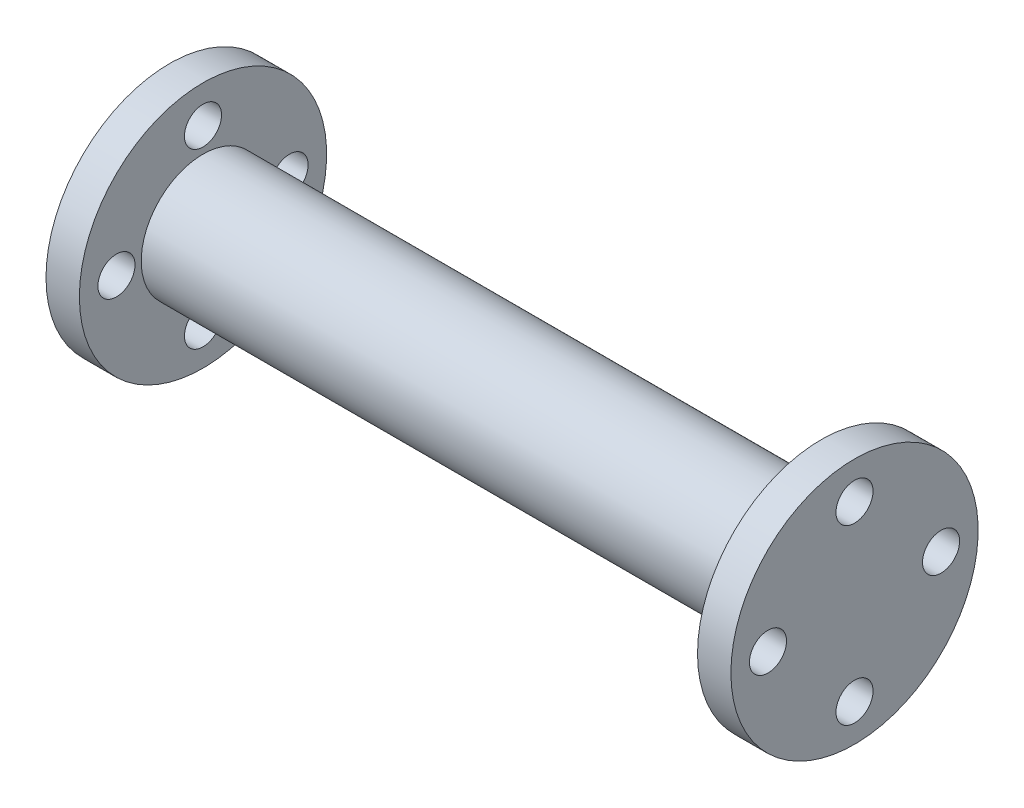
ISO-10303-21;
HEADER;
FILE_DESCRIPTION(('STEP AP214'),'2;1');
FILE_NAME('part.step','',(''),(''),'','','');
FILE_SCHEMA(('AUTOMOTIVE_DESIGN { 1 0 10303 214 1 1 1 1 }'));
ENDSEC;
DATA;
#1=APPLICATION_CONTEXT('core data for automotive mechanical design processes');
#2=APPLICATION_PROTOCOL_DEFINITION('international standard','automotive_design',2000,#1);
#3=PRODUCT_CONTEXT('',#1,'mechanical');
#4=PRODUCT('Part','Part','',(#3));
#5=PRODUCT_RELATED_PRODUCT_CATEGORY('part','',(#4));
#6=PRODUCT_DEFINITION_FORMATION('','',#4);
#7=PRODUCT_DEFINITION_CONTEXT('part definition',#1,'design');
#8=PRODUCT_DEFINITION('design','',#6,#7);
#9=PRODUCT_DEFINITION_SHAPE('','',#8);
#10=(LENGTH_UNIT() NAMED_UNIT(*) SI_UNIT(.MILLI.,.METRE.));
#11=(NAMED_UNIT(*) PLANE_ANGLE_UNIT() SI_UNIT($,.RADIAN.));
#12=(NAMED_UNIT(*) SI_UNIT($,.STERADIAN.) SOLID_ANGLE_UNIT());
#13=UNCERTAINTY_MEASURE_WITH_UNIT(LENGTH_MEASURE(1.E-05),#10,'distance_accuracy_value','');
#14=(GEOMETRIC_REPRESENTATION_CONTEXT(3) GLOBAL_UNCERTAINTY_ASSIGNED_CONTEXT((#13)) GLOBAL_UNIT_ASSIGNED_CONTEXT((#10,
#11,#12)) REPRESENTATION_CONTEXT('',''));
#15=CARTESIAN_POINT('',(0.,0.,0.));
#16=DIRECTION('',(0.,0.,1.));
#17=DIRECTION('',(1.,0.,0.));
#18=AXIS2_PLACEMENT_3D('',#15,#16,#17);
#19=CARTESIAN_POINT('',(2.7,0.,0.));
#20=DIRECTION('',(-1.,0.,0.));
#21=DIRECTION('',(0.,0.,1.));
#22=AXIS2_PLACEMENT_3D('',#19,#20,#21);
#23=CYLINDRICAL_SURFACE('',#22,10.);
#24=CARTESIAN_POINT('',(2.7,0.,0.));
#25=DIRECTION('',(1.,0.,0.));
#26=DIRECTION('',(0.,0.,-1.));
#27=AXIS2_PLACEMENT_3D('',#24,#25,#26);
#28=CIRCLE('',#27,10.);
#29=CARTESIAN_POINT('',(2.7,0.,10.));
#30=VERTEX_POINT('',#29);
#31=EDGE_CURVE('E39',#30,#30,#28,.T.);
#32=CARTESIAN_POINT('',(0.,0.,0.));
#33=DIRECTION('',(1.,0.,0.));
#34=DIRECTION('',(0.,0.,-1.));
#35=AXIS2_PLACEMENT_3D('',#32,#33,#34);
#36=CIRCLE('',#35,10.);
#37=CARTESIAN_POINT('',(0.,0.,10.));
#38=VERTEX_POINT('',#37);
#39=EDGE_CURVE('E44',#38,#38,#36,.T.);
#40=CARTESIAN_POINT('',(2.7,0.,10.));
#41=CARTESIAN_POINT('',(2.671875,0.,10.));
#42=CARTESIAN_POINT('',(2.64375,0.,10.));
#43=CARTESIAN_POINT('',(2.5875,0.,10.));
#44=CARTESIAN_POINT('',(2.559375,0.,10.));
#45=CARTESIAN_POINT('',(2.503125,0.,10.));
#46=CARTESIAN_POINT('',(2.475,0.,10.));
#47=CARTESIAN_POINT('',(2.41875,0.,10.));
#48=CARTESIAN_POINT('',(2.390625,0.,10.));
#49=CARTESIAN_POINT('',(2.334375,0.,10.));
#50=CARTESIAN_POINT('',(2.30625,0.,10.));
#51=CARTESIAN_POINT('',(2.25,0.,10.));
#52=CARTESIAN_POINT('',(2.221875,0.,10.));
#53=CARTESIAN_POINT('',(2.165625,0.,10.));
#54=CARTESIAN_POINT('',(2.1375,0.,10.));
#55=CARTESIAN_POINT('',(2.08125,0.,10.));
#56=CARTESIAN_POINT('',(2.053125,0.,10.));
#57=CARTESIAN_POINT('',(1.996875,0.,10.));
#58=CARTESIAN_POINT('',(1.96875,0.,10.));
#59=CARTESIAN_POINT('',(1.9125,0.,10.));
#60=CARTESIAN_POINT('',(1.884375,0.,10.));
#61=CARTESIAN_POINT('',(1.828125,0.,10.));
#62=CARTESIAN_POINT('',(1.8,0.,10.));
#63=CARTESIAN_POINT('',(1.74375,0.,10.));
#64=CARTESIAN_POINT('',(1.715625,0.,10.));
#65=CARTESIAN_POINT('',(1.659375,0.,10.));
#66=CARTESIAN_POINT('',(1.63125,0.,10.));
#67=CARTESIAN_POINT('',(1.575,0.,10.));
#68=CARTESIAN_POINT('',(1.546875,0.,10.));
#69=CARTESIAN_POINT('',(1.490625,0.,10.));
#70=CARTESIAN_POINT('',(1.4625,0.,10.));
#71=CARTESIAN_POINT('',(1.40625,0.,10.));
#72=CARTESIAN_POINT('',(1.378125,0.,10.));
#73=CARTESIAN_POINT('',(1.321875,0.,10.));
#74=CARTESIAN_POINT('',(1.29375,0.,10.));
#75=CARTESIAN_POINT('',(1.2375,0.,10.));
#76=CARTESIAN_POINT('',(1.209375,0.,10.));
#77=CARTESIAN_POINT('',(1.153125,0.,10.));
#78=CARTESIAN_POINT('',(1.125,0.,10.));
#79=CARTESIAN_POINT('',(1.06875,0.,10.));
#80=CARTESIAN_POINT('',(1.040625,0.,10.));
#81=CARTESIAN_POINT('',(0.984375,0.,10.));
#82=CARTESIAN_POINT('',(0.956249999999999,0.,10.));
#83=CARTESIAN_POINT('',(0.899999999999999,0.,10.));
#84=CARTESIAN_POINT('',(0.871875,0.,10.));
#85=CARTESIAN_POINT('',(0.815624999999999,0.,10.));
#86=CARTESIAN_POINT('',(0.787499999999999,0.,10.));
#87=CARTESIAN_POINT('',(0.73125,0.,10.));
#88=CARTESIAN_POINT('',(0.703125,0.,10.));
#89=CARTESIAN_POINT('',(0.646875,0.,10.));
#90=CARTESIAN_POINT('',(0.61875,0.,10.));
#91=CARTESIAN_POINT('',(0.5625,0.,10.));
#92=CARTESIAN_POINT('',(0.534375,0.,10.));
#93=CARTESIAN_POINT('',(0.478125,0.,10.));
#94=CARTESIAN_POINT('',(0.45,0.,10.));
#95=CARTESIAN_POINT('',(0.39375,0.,10.));
#96=CARTESIAN_POINT('',(0.365625,0.,10.));
#97=CARTESIAN_POINT('',(0.309375,0.,10.));
#98=CARTESIAN_POINT('',(0.28125,0.,10.));
#99=CARTESIAN_POINT('',(0.225,0.,10.));
#100=CARTESIAN_POINT('',(0.196875,0.,10.));
#101=CARTESIAN_POINT('',(0.140625,0.,10.));
#102=CARTESIAN_POINT('',(0.1125,0.,10.));
#103=CARTESIAN_POINT('',(0.0562499999999997,0.,10.));
#104=CARTESIAN_POINT('',(0.0281249999999996,0.,10.));
#105=CARTESIAN_POINT('',(0.,0.,10.));
#106=B_SPLINE_CURVE_WITH_KNOTS('',3,(#40,#41,#42,#43,#44,#45,#46,#47,#48,#49,#50,#51,#52,#53,
#54,#55,#56,#57,#58,#59,#60,#61,#62,#63,#64,#65,#66,#67,#68,#69,#70,#71,#72,#73,#74,#75,#76,#77,
#78,#79,#80,#81,#82,#83,#84,#85,#86,#87,#88,#89,#90,#91,#92,#93,#94,#95,#96,#97,#98,#99,#100,
#101,#102,#103,#104,#105),.UNSPECIFIED.,.F.,.F.,(4,2,2,2,2,2,2,2,2,2,2,2,2,2,2,2,2,2,2,2,2,2,2,
2,2,2,2,2,2,2,2,2,4),(0.,0.0843750000000003,0.16875,0.253125,0.3375,0.421875,0.50625,0.590625,
0.675,0.759375,0.84375,0.928125000000001,1.0125,1.096875,1.18125,1.265625,1.35,1.434375,1.51875,
1.603125,1.6875,1.771875,1.85625,1.940625,2.025,2.109375,2.19375,2.278125,2.3625,2.446875,
2.53125,2.615625,2.7),.UNSPECIFIED.);
#107=EDGE_CURVE('BSEAM32',#30,#38,#106,.T.);
#108=ORIENTED_EDGE('',*,*,#31,.F.);
#109=ORIENTED_EDGE('',*,*,#39,.T.);
#110=ORIENTED_EDGE('',*,*,#107,.T.);
#111=ORIENTED_EDGE('',*,*,#107,.F.);
#112=EDGE_LOOP('',(#108,#110,#109,#111));
#113=FACE_BOUND('',#112,.T.);
#114=ADVANCED_FACE('F32',(#113),#23,.T.);
#115=CARTESIAN_POINT('',(2.7,0.,0.));
#116=DIRECTION('',(1.,0.,0.));
#117=DIRECTION('',(0.,0.,-1.));
#118=AXIS2_PLACEMENT_3D('',#115,#116,#117);
#119=PLANE('',#118);
#120=CARTESIAN_POINT('',(2.7,7.,0.));
#121=DIRECTION('',(1.,0.,0.));
#122=DIRECTION('',(0.,0.,-1.));
#123=AXIS2_PLACEMENT_3D('',#120,#121,#122);
#124=CIRCLE('',#123,1.5);
#125=CARTESIAN_POINT('',(2.7,7.,-1.5));
#126=VERTEX_POINT('',#125);
#127=EDGE_CURVE('E83',#126,#126,#124,.T.);
#128=ORIENTED_EDGE('',*,*,#127,.F.);
#129=EDGE_LOOP('',(#128));
#130=FACE_BOUND('',#129,.T.);
#131=CARTESIAN_POINT('',(2.7,1.98094713253425E-13,-7.0000000000002));
#132=DIRECTION('',(1.,0.,0.));
#133=DIRECTION('',(0.,0.,-1.));
#134=AXIS2_PLACEMENT_3D('',#131,#132,#133);
#135=CIRCLE('',#134,1.50000000000015);
#136=CARTESIAN_POINT('',(2.7,1.98094713253425E-13,-8.50000000000035));
#137=VERTEX_POINT('',#136);
#138=EDGE_CURVE('E68',#137,#137,#135,.T.);
#139=ORIENTED_EDGE('',*,*,#138,.F.);
#140=EDGE_LOOP('',(#139));
#141=FACE_BOUND('',#140,.T.);
#142=CARTESIAN_POINT('',(2.7,-7.,-3.9618942650685E-13));
#143=DIRECTION('',(1.,0.,0.));
#144=DIRECTION('',(0.,0.,-1.));
#145=AXIS2_PLACEMENT_3D('',#142,#143,#144);
#146=CIRCLE('',#145,1.50000000000043);
#147=CARTESIAN_POINT('',(2.7,-7.,-1.50000000000082));
#148=VERTEX_POINT('',#147);
#149=EDGE_CURVE('E64',#148,#148,#146,.T.);
#150=ORIENTED_EDGE('',*,*,#149,.F.);
#151=EDGE_LOOP('',(#150));
#152=FACE_BOUND('',#151,.T.);
#153=CARTESIAN_POINT('',(2.7,-1.98951966012828E-13,6.9999999999998));
#154=DIRECTION('',(1.,0.,0.));
#155=DIRECTION('',(0.,0.,-1.));
#156=AXIS2_PLACEMENT_3D('',#153,#154,#155);
#157=CIRCLE('',#156,1.50000000000032);
#158=CARTESIAN_POINT('',(2.7,-1.98951966012828E-13,5.49999999999948));
#159=VERTEX_POINT('',#158);
#160=EDGE_CURVE('E60',#159,#159,#157,.T.);
#161=ORIENTED_EDGE('',*,*,#160,.F.);
#162=EDGE_LOOP('',(#161));
#163=FACE_BOUND('',#162,.T.);
#164=CARTESIAN_POINT('',(2.7,0.,0.));
#165=DIRECTION('',(1.,0.,0.));
#166=DIRECTION('',(0.,0.,-1.));
#167=AXIS2_PLACEMENT_3D('',#164,#165,#166);
#168=CIRCLE('',#167,5.);
#169=CARTESIAN_POINT('',(2.7,0.,-5.));
#170=VERTEX_POINT('',#169);
#171=EDGE_CURVE('E10',#170,#170,#168,.T.);
#172=ORIENTED_EDGE('',*,*,#171,.F.);
#173=EDGE_LOOP('',(#172));
#174=FACE_BOUND('',#173,.T.);
#175=ORIENTED_EDGE('',*,*,#31,.T.);
#176=EDGE_LOOP('',(#175));
#177=FACE_BOUND('',#176,.T.);
#178=ADVANCED_FACE('F113',(#130,#141,#152,#163,#174,#177),#119,.T.);
#179=CARTESIAN_POINT('',(0.,0.,0.));
#180=DIRECTION('',(1.,0.,0.));
#181=DIRECTION('',(0.,0.,-1.));
#182=AXIS2_PLACEMENT_3D('',#179,#180,#181);
#183=PLANE('',#182);
#184=CARTESIAN_POINT('',(0.,7.,0.));
#185=DIRECTION('',(1.,0.,0.));
#186=DIRECTION('',(0.,0.,-1.));
#187=AXIS2_PLACEMENT_3D('',#184,#185,#186);
#188=CIRCLE('',#187,1.5);
#189=CARTESIAN_POINT('',(0.,7.,-1.5));
#190=VERTEX_POINT('',#189);
#191=EDGE_CURVE('E80',#190,#190,#188,.T.);
#192=ORIENTED_EDGE('',*,*,#191,.T.);
#193=EDGE_LOOP('',(#192));
#194=FACE_BOUND('',#193,.T.);
#195=CARTESIAN_POINT('',(0.,1.98094713253425E-13,-7.0000000000002));
#196=DIRECTION('',(1.,0.,0.));
#197=DIRECTION('',(0.,0.,-1.));
#198=AXIS2_PLACEMENT_3D('',#195,#196,#197);
#199=CIRCLE('',#198,1.50000000000015);
#200=CARTESIAN_POINT('',(0.,1.98094713253425E-13,-8.50000000000035));
#201=VERTEX_POINT('',#200);
#202=EDGE_CURVE('E63',#201,#201,#199,.T.);
#203=ORIENTED_EDGE('',*,*,#202,.T.);
#204=EDGE_LOOP('',(#203));
#205=FACE_BOUND('',#204,.T.);
#206=CARTESIAN_POINT('',(0.,-7.,-3.9618942650685E-13));
#207=DIRECTION('',(1.,0.,0.));
#208=DIRECTION('',(0.,0.,-1.));
#209=AXIS2_PLACEMENT_3D('',#206,#207,#208);
#210=CIRCLE('',#209,1.50000000000043);
#211=CARTESIAN_POINT('',(0.,-7.,-1.50000000000082));
#212=VERTEX_POINT('',#211);
#213=EDGE_CURVE('E59',#212,#212,#210,.T.);
#214=ORIENTED_EDGE('',*,*,#213,.T.);
#215=EDGE_LOOP('',(#214));
#216=FACE_BOUND('',#215,.T.);
#217=CARTESIAN_POINT('',(0.,-1.98951966012828E-13,6.9999999999998));
#218=DIRECTION('',(1.,0.,0.));
#219=DIRECTION('',(0.,0.,-1.));
#220=AXIS2_PLACEMENT_3D('',#217,#218,#219);
#221=CIRCLE('',#220,1.50000000000032);
#222=CARTESIAN_POINT('',(0.,-1.98951966012828E-13,5.49999999999948));
#223=VERTEX_POINT('',#222);
#224=EDGE_CURVE('E55',#223,#223,#221,.T.);
#225=ORIENTED_EDGE('',*,*,#224,.T.);
#226=EDGE_LOOP('',(#225));
#227=FACE_BOUND('',#226,.T.);
#228=ORIENTED_EDGE('',*,*,#39,.F.);
#229=EDGE_LOOP('',(#228));
#230=FACE_BOUND('',#229,.T.);
#231=ADVANCED_FACE('F118',(#194,#205,#216,#227,#230),#183,.F.);
#232=CARTESIAN_POINT('',(52.7,0.,0.));
#233=DIRECTION('',(-1.,0.,0.));
#234=DIRECTION('',(0.,0.,1.));
#235=AXIS2_PLACEMENT_3D('',#232,#233,#234);
#236=CYLINDRICAL_SURFACE('',#235,5.);
#237=CARTESIAN_POINT('',(52.7,0.,0.));
#238=DIRECTION('',(1.,0.,0.));
#239=DIRECTION('',(0.,0.,-1.));
#240=AXIS2_PLACEMENT_3D('',#237,#238,#239);
#241=CIRCLE('',#240,5.);
#242=CARTESIAN_POINT('',(52.7,0.,-5.));
#243=VERTEX_POINT('',#242);
#244=EDGE_CURVE('E47',#243,#243,#241,.T.);
#245=ORIENTED_EDGE('',*,*,#244,.F.);
#246=EDGE_LOOP('',(#245));
#247=FACE_BOUND('',#246,.T.);
#248=ORIENTED_EDGE('',*,*,#171,.T.);
#249=EDGE_LOOP('',(#248));
#250=FACE_BOUND('',#249,.T.);
#251=ADVANCED_FACE('F126',(#247,#250),#236,.T.);
#252=CARTESIAN_POINT('',(55.4,0.,0.));
#253=DIRECTION('',(-1.,0.,0.));
#254=DIRECTION('',(0.,0.,1.));
#255=AXIS2_PLACEMENT_3D('',#252,#253,#254);
#256=CYLINDRICAL_SURFACE('',#255,10.);
#257=CARTESIAN_POINT('',(55.4,0.,0.));
#258=DIRECTION('',(1.,0.,0.));
#259=DIRECTION('',(0.,0.,-1.));
#260=AXIS2_PLACEMENT_3D('',#257,#258,#259);
#261=CIRCLE('',#260,10.);
#262=CARTESIAN_POINT('',(55.4,0.,10.));
#263=VERTEX_POINT('',#262);
#264=EDGE_CURVE('E87',#263,#263,#261,.T.);
#265=CARTESIAN_POINT('',(52.7,0.,0.));
#266=DIRECTION('',(1.,0.,0.));
#267=DIRECTION('',(0.,0.,-1.));
#268=AXIS2_PLACEMENT_3D('',#265,#266,#267);
#269=CIRCLE('',#268,10.);
#270=CARTESIAN_POINT('',(52.7,0.,10.));
#271=VERTEX_POINT('',#270);
#272=EDGE_CURVE('E86',#271,#271,#269,.T.);
#273=CARTESIAN_POINT('',(55.4,0.,10.));
#274=CARTESIAN_POINT('',(55.371875,0.,10.));
#275=CARTESIAN_POINT('',(55.34375,0.,10.));
#276=CARTESIAN_POINT('',(55.2875,0.,10.));
#277=CARTESIAN_POINT('',(55.259375,0.,10.));
#278=CARTESIAN_POINT('',(55.203125,0.,10.));
#279=CARTESIAN_POINT('',(55.175,0.,10.));
#280=CARTESIAN_POINT('',(55.11875,0.,10.));
#281=CARTESIAN_POINT('',(55.090625,0.,10.));
#282=CARTESIAN_POINT('',(55.034375,0.,10.));
#283=CARTESIAN_POINT('',(55.00625,0.,10.));
#284=CARTESIAN_POINT('',(54.95,0.,10.));
#285=CARTESIAN_POINT('',(54.921875,0.,10.));
#286=CARTESIAN_POINT('',(54.865625,0.,10.));
#287=CARTESIAN_POINT('',(54.8375,0.,10.));
#288=CARTESIAN_POINT('',(54.78125,0.,10.));
#289=CARTESIAN_POINT('',(54.753125,0.,10.));
#290=CARTESIAN_POINT('',(54.696875,0.,10.));
#291=CARTESIAN_POINT('',(54.66875,0.,10.));
#292=CARTESIAN_POINT('',(54.6125,0.,10.));
#293=CARTESIAN_POINT('',(54.584375,0.,10.));
#294=CARTESIAN_POINT('',(54.528125,0.,10.));
#295=CARTESIAN_POINT('',(54.5,0.,10.));
#296=CARTESIAN_POINT('',(54.44375,0.,10.));
#297=CARTESIAN_POINT('',(54.415625,0.,10.));
#298=CARTESIAN_POINT('',(54.359375,0.,10.));
#299=CARTESIAN_POINT('',(54.33125,0.,10.));
#300=CARTESIAN_POINT('',(54.275,0.,10.));
#301=CARTESIAN_POINT('',(54.246875,0.,10.));
#302=CARTESIAN_POINT('',(54.190625,0.,10.));
#303=CARTESIAN_POINT('',(54.1625,0.,10.));
#304=CARTESIAN_POINT('',(54.10625,0.,10.));
#305=CARTESIAN_POINT('',(54.078125,0.,10.));
#306=CARTESIAN_POINT('',(54.021875,0.,10.));
#307=CARTESIAN_POINT('',(53.99375,0.,10.));
#308=CARTESIAN_POINT('',(53.9375,0.,10.));
#309=CARTESIAN_POINT('',(53.909375,0.,10.));
#310=CARTESIAN_POINT('',(53.853125,0.,10.));
#311=CARTESIAN_POINT('',(53.825,0.,10.));
#312=CARTESIAN_POINT('',(53.76875,0.,10.));
#313=CARTESIAN_POINT('',(53.740625,0.,10.));
#314=CARTESIAN_POINT('',(53.684375,0.,10.));
#315=CARTESIAN_POINT('',(53.65625,0.,10.));
#316=CARTESIAN_POINT('',(53.6,0.,10.));
#317=CARTESIAN_POINT('',(53.571875,0.,10.));
#318=CARTESIAN_POINT('',(53.515625,0.,10.));
#319=CARTESIAN_POINT('',(53.4875,0.,10.));
#320=CARTESIAN_POINT('',(53.43125,0.,10.));
#321=CARTESIAN_POINT('',(53.403125,0.,10.));
#322=CARTESIAN_POINT('',(53.346875,0.,10.));
#323=CARTESIAN_POINT('',(53.31875,0.,10.));
#324=CARTESIAN_POINT('',(53.2625,0.,10.));
#325=CARTESIAN_POINT('',(53.234375,0.,10.));
#326=CARTESIAN_POINT('',(53.178125,0.,10.));
#327=CARTESIAN_POINT('',(53.15,0.,10.));
#328=CARTESIAN_POINT('',(53.09375,0.,10.));
#329=CARTESIAN_POINT('',(53.065625,0.,10.));
#330=CARTESIAN_POINT('',(53.009375,0.,10.));
#331=CARTESIAN_POINT('',(52.98125,0.,10.));
#332=CARTESIAN_POINT('',(52.925,0.,10.));
#333=CARTESIAN_POINT('',(52.896875,0.,10.));
#334=CARTESIAN_POINT('',(52.840625,0.,10.));
#335=CARTESIAN_POINT('',(52.8125,0.,10.));
#336=CARTESIAN_POINT('',(52.75625,0.,10.));
#337=CARTESIAN_POINT('',(52.728125,0.,10.));
#338=CARTESIAN_POINT('',(52.7,0.,10.));
#339=B_SPLINE_CURVE_WITH_KNOTS('',3,(#273,#274,#275,#276,#277,#278,#279,#280,#281,#282,#283,
#284,#285,#286,#287,#288,#289,#290,#291,#292,#293,#294,#295,#296,#297,#298,#299,#300,#301,#302,
#303,#304,#305,#306,#307,#308,#309,#310,#311,#312,#313,#314,#315,#316,#317,#318,#319,#320,#321,
#322,#323,#324,#325,#326,#327,#328,#329,#330,#331,#332,#333,#334,#335,#336,#337,#338),
.UNSPECIFIED.,.F.,.F.,(4,2,2,2,2,2,2,2,2,2,2,2,2,2,2,2,2,2,2,2,2,2,2,2,2,2,2,2,2,2,2,2,4),(0.,
0.0843750000000046,0.168750000000002,0.253125000000007,0.337500000000004,0.421875000000002,
0.506250000000007,0.590625000000004,0.675000000000002,0.759375000000007,0.843750000000004,
0.928125000000002,1.01250000000001,1.096875,1.18125,1.26562500000001,1.35,1.434375,
1.51875000000001,1.603125,1.6875,1.77187500000001,1.85625,1.940625,2.02500000000001,2.109375,
2.19375,2.27812500000001,2.3625,2.446875,2.53125000000001,2.615625,2.7),.UNSPECIFIED.);
#340=EDGE_CURVE('BSEAM92',#263,#271,#339,.T.);
#341=ORIENTED_EDGE('',*,*,#264,.F.);
#342=ORIENTED_EDGE('',*,*,#272,.T.);
#343=ORIENTED_EDGE('',*,*,#340,.T.);
#344=ORIENTED_EDGE('',*,*,#340,.F.);
#345=EDGE_LOOP('',(#341,#343,#342,#344));
#346=FACE_BOUND('',#345,.T.);
#347=ADVANCED_FACE('F92',(#346),#256,.T.);
#348=CARTESIAN_POINT('',(55.4,0.,0.));
#349=DIRECTION('',(1.,0.,0.));
#350=DIRECTION('',(0.,0.,-1.));
#351=AXIS2_PLACEMENT_3D('',#348,#349,#350);
#352=PLANE('',#351);
#353=CARTESIAN_POINT('',(55.4,7.,0.));
#354=DIRECTION('',(1.,0.,0.));
#355=DIRECTION('',(0.,0.,-1.));
#356=AXIS2_PLACEMENT_3D('',#353,#354,#355);
#357=CIRCLE('',#356,1.5);
#358=CARTESIAN_POINT('',(55.4,7.,-1.5));
#359=VERTEX_POINT('',#358);
#360=EDGE_CURVE('E56',#359,#359,#357,.T.);
#361=ORIENTED_EDGE('',*,*,#360,.F.);
#362=EDGE_LOOP('',(#361));
#363=FACE_BOUND('',#362,.T.);
#364=CARTESIAN_POINT('',(55.4,1.98094713253425E-13,-7.0000000000002));
#365=DIRECTION('',(1.,0.,0.));
#366=DIRECTION('',(0.,0.,-1.));
#367=AXIS2_PLACEMENT_3D('',#364,#365,#366);
#368=CIRCLE('',#367,1.50000000000015);
#369=CARTESIAN_POINT('',(55.4,1.98094713253425E-13,-8.50000000000035));
#370=VERTEX_POINT('',#369);
#371=EDGE_CURVE('E246',#370,#370,#368,.T.);
#372=ORIENTED_EDGE('',*,*,#371,.F.);
#373=EDGE_LOOP('',(#372));
#374=FACE_BOUND('',#373,.T.);
#375=CARTESIAN_POINT('',(55.4,-7.,-3.9618942650685E-13));
#376=DIRECTION('',(1.,0.,0.));
#377=DIRECTION('',(0.,0.,-1.));
#378=AXIS2_PLACEMENT_3D('',#375,#376,#377);
#379=CIRCLE('',#378,1.50000000000043);
#380=CARTESIAN_POINT('',(55.4,-7.,-1.50000000000082));
#381=VERTEX_POINT('',#380);
#382=EDGE_CURVE('E243',#381,#381,#379,.T.);
#383=ORIENTED_EDGE('',*,*,#382,.F.);
#384=EDGE_LOOP('',(#383));
#385=FACE_BOUND('',#384,.T.);
#386=CARTESIAN_POINT('',(55.4,-1.98951966012828E-13,6.9999999999998));
#387=DIRECTION('',(1.,0.,0.));
#388=DIRECTION('',(0.,0.,-1.));
#389=AXIS2_PLACEMENT_3D('',#386,#387,#388);
#390=CIRCLE('',#389,1.50000000000032);
#391=CARTESIAN_POINT('',(55.4,-1.98951966012828E-13,5.49999999999948));
#392=VERTEX_POINT('',#391);
#393=EDGE_CURVE('E240',#392,#392,#390,.T.);
#394=ORIENTED_EDGE('',*,*,#393,.F.);
#395=EDGE_LOOP('',(#394));
#396=FACE_BOUND('',#395,.T.);
#397=ORIENTED_EDGE('',*,*,#264,.T.);
#398=EDGE_LOOP('',(#397));
#399=FACE_BOUND('',#398,.T.);
#400=ADVANCED_FACE('F97',(#363,#374,#385,#396,#399),#352,.T.);
#401=CARTESIAN_POINT('',(52.7,0.,0.));
#402=DIRECTION('',(1.,0.,0.));
#403=DIRECTION('',(0.,0.,-1.));
#404=AXIS2_PLACEMENT_3D('',#401,#402,#403);
#405=PLANE('',#404);
#406=CARTESIAN_POINT('',(52.7,7.,0.));
#407=DIRECTION('',(1.,0.,0.));
#408=DIRECTION('',(0.,0.,-1.));
#409=AXIS2_PLACEMENT_3D('',#406,#407,#408);
#410=CIRCLE('',#409,1.5);
#411=CARTESIAN_POINT('',(52.7,7.,-1.5));
#412=VERTEX_POINT('',#411);
#413=EDGE_CURVE('E35',#412,#412,#410,.T.);
#414=ORIENTED_EDGE('',*,*,#413,.T.);
#415=EDGE_LOOP('',(#414));
#416=FACE_BOUND('',#415,.T.);
#417=CARTESIAN_POINT('',(52.7,1.98094713253425E-13,-7.0000000000002));
#418=DIRECTION('',(1.,0.,0.));
#419=DIRECTION('',(0.,0.,-1.));
#420=AXIS2_PLACEMENT_3D('',#417,#418,#419);
#421=CIRCLE('',#420,1.50000000000015);
#422=CARTESIAN_POINT('',(52.7,1.98094713253425E-13,-8.50000000000035));
#423=VERTEX_POINT('',#422);
#424=EDGE_CURVE('E61',#423,#423,#421,.T.);
#425=ORIENTED_EDGE('',*,*,#424,.T.);
#426=EDGE_LOOP('',(#425));
#427=FACE_BOUND('',#426,.T.);
#428=CARTESIAN_POINT('',(52.7,-7.,-3.9618942650685E-13));
#429=DIRECTION('',(1.,0.,0.));
#430=DIRECTION('',(0.,0.,-1.));
#431=AXIS2_PLACEMENT_3D('',#428,#429,#430);
#432=CIRCLE('',#431,1.50000000000043);
#433=CARTESIAN_POINT('',(52.7,-7.,-1.50000000000082));
#434=VERTEX_POINT('',#433);
#435=EDGE_CURVE('E57',#434,#434,#432,.T.);
#436=ORIENTED_EDGE('',*,*,#435,.T.);
#437=EDGE_LOOP('',(#436));
#438=FACE_BOUND('',#437,.T.);
#439=CARTESIAN_POINT('',(52.7,-1.98951966012828E-13,6.9999999999998));
#440=DIRECTION('',(1.,0.,0.));
#441=DIRECTION('',(0.,0.,-1.));
#442=AXIS2_PLACEMENT_3D('',#439,#440,#441);
#443=CIRCLE('',#442,1.50000000000032);
#444=CARTESIAN_POINT('',(52.7,-1.98951966012828E-13,5.49999999999948));
#445=VERTEX_POINT('',#444);
#446=EDGE_CURVE('E52',#445,#445,#443,.T.);
#447=ORIENTED_EDGE('',*,*,#446,.T.);
#448=EDGE_LOOP('',(#447));
#449=FACE_BOUND('',#448,.T.);
#450=ORIENTED_EDGE('',*,*,#244,.T.);
#451=EDGE_LOOP('',(#450));
#452=FACE_BOUND('',#451,.T.);
#453=ORIENTED_EDGE('',*,*,#272,.F.);
#454=EDGE_LOOP('',(#453));
#455=FACE_BOUND('',#454,.T.);
#456=ADVANCED_FACE('F94',(#416,#427,#438,#449,#452,#455),#405,.F.);
#457=CARTESIAN_POINT('',(-4.59999999999999,-1.98951966012828E-13,6.9999999999998));
#458=DIRECTION('',(1.,0.,0.));
#459=DIRECTION('',(0.,0.,-1.));
#460=AXIS2_PLACEMENT_3D('',#457,#458,#459);
#461=CYLINDRICAL_SURFACE('',#460,1.50000000000032);
#462=ORIENTED_EDGE('',*,*,#393,.T.);
#463=EDGE_LOOP('',(#462));
#464=FACE_BOUND('',#463,.T.);
#465=ORIENTED_EDGE('',*,*,#446,.F.);
#466=EDGE_LOOP('',(#465));
#467=FACE_BOUND('',#466,.T.);
#468=ADVANCED_FACE('F96',(#464,#467),#461,.F.);
#469=CARTESIAN_POINT('',(-4.59999999999999,-7.,-3.9618942650685E-13));
#470=DIRECTION('',(1.,0.,0.));
#471=DIRECTION('',(0.,0.,-1.));
#472=AXIS2_PLACEMENT_3D('',#469,#470,#471);
#473=CYLINDRICAL_SURFACE('',#472,1.50000000000043);
#474=ORIENTED_EDGE('',*,*,#382,.T.);
#475=EDGE_LOOP('',(#474));
#476=FACE_BOUND('',#475,.T.);
#477=ORIENTED_EDGE('',*,*,#435,.F.);
#478=EDGE_LOOP('',(#477));
#479=FACE_BOUND('',#478,.T.);
#480=ADVANCED_FACE('F104',(#476,#479),#473,.F.);
#481=CARTESIAN_POINT('',(-4.59999999999999,1.98094713253425E-13,-7.0000000000002));
#482=DIRECTION('',(1.,0.,0.));
#483=DIRECTION('',(0.,0.,-1.));
#484=AXIS2_PLACEMENT_3D('',#481,#482,#483);
#485=CYLINDRICAL_SURFACE('',#484,1.50000000000015);
#486=ORIENTED_EDGE('',*,*,#371,.T.);
#487=EDGE_LOOP('',(#486));
#488=FACE_BOUND('',#487,.T.);
#489=ORIENTED_EDGE('',*,*,#424,.F.);
#490=EDGE_LOOP('',(#489));
#491=FACE_BOUND('',#490,.T.);
#492=ADVANCED_FACE('F168',(#488,#491),#485,.F.);
#493=CARTESIAN_POINT('',(-4.59999999999999,7.,0.));
#494=DIRECTION('',(1.,0.,0.));
#495=DIRECTION('',(0.,0.,-1.));
#496=AXIS2_PLACEMENT_3D('',#493,#494,#495);
#497=CYLINDRICAL_SURFACE('',#496,1.5);
#498=ORIENTED_EDGE('',*,*,#360,.T.);
#499=EDGE_LOOP('',(#498));
#500=FACE_BOUND('',#499,.T.);
#501=ORIENTED_EDGE('',*,*,#413,.F.);
#502=EDGE_LOOP('',(#501));
#503=FACE_BOUND('',#502,.T.);
#504=ADVANCED_FACE('F179',(#500,#503),#497,.F.);
#505=ORIENTED_EDGE('',*,*,#160,.T.);
#506=EDGE_LOOP('',(#505));
#507=FACE_BOUND('',#506,.T.);
#508=ORIENTED_EDGE('',*,*,#224,.F.);
#509=EDGE_LOOP('',(#508));
#510=FACE_BOUND('',#509,.T.);
#511=ADVANCED_FACE('F107',(#507,#510),#461,.F.);
#512=ORIENTED_EDGE('',*,*,#149,.T.);
#513=EDGE_LOOP('',(#512));
#514=FACE_BOUND('',#513,.T.);
#515=ORIENTED_EDGE('',*,*,#213,.F.);
#516=EDGE_LOOP('',(#515));
#517=FACE_BOUND('',#516,.T.);
#518=ADVANCED_FACE('F171',(#514,#517),#473,.F.);
#519=ORIENTED_EDGE('',*,*,#138,.T.);
#520=EDGE_LOOP('',(#519));
#521=FACE_BOUND('',#520,.T.);
#522=ORIENTED_EDGE('',*,*,#202,.F.);
#523=EDGE_LOOP('',(#522));
#524=FACE_BOUND('',#523,.T.);
#525=ADVANCED_FACE('F182',(#521,#524),#485,.F.);
#526=ORIENTED_EDGE('',*,*,#127,.T.);
#527=EDGE_LOOP('',(#526));
#528=FACE_BOUND('',#527,.T.);
#529=ORIENTED_EDGE('',*,*,#191,.F.);
#530=EDGE_LOOP('',(#529));
#531=FACE_BOUND('',#530,.T.);
#532=ADVANCED_FACE('F192',(#528,#531),#497,.F.);
#533=CLOSED_SHELL('',(#114,#178,#231,#251,#347,#400,#456,#468,#480,#492,#504,#511,#518,#525,#532));
#534=MANIFOLD_SOLID_BREP('B2',#533);
#535=ADVANCED_BREP_SHAPE_REPRESENTATION('',(#18,#534),#14);
#536=SHAPE_DEFINITION_REPRESENTATION(#9,#535);
ENDSEC;
END-ISO-10303-21;
